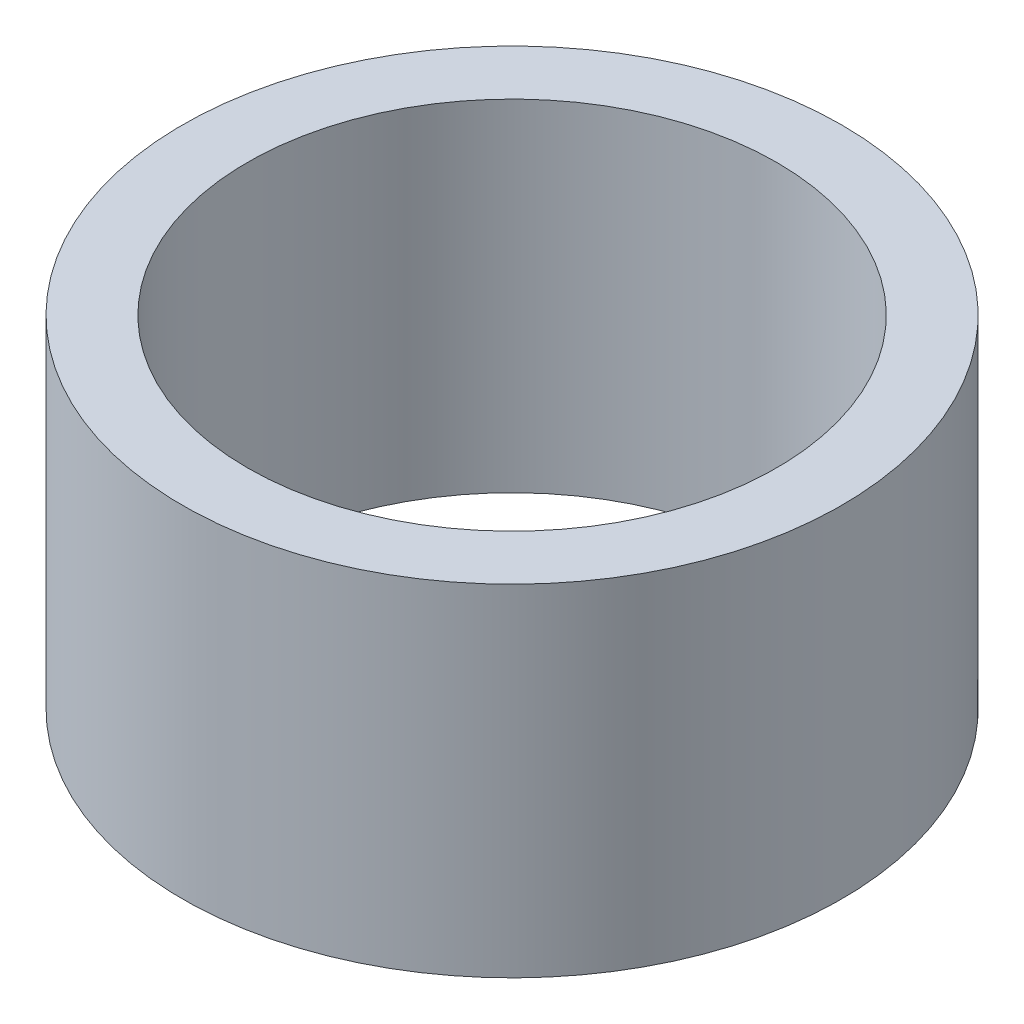
ISO-10303-21;
HEADER;
FILE_DESCRIPTION(('STEP AP214'),'2;1');
FILE_NAME('part.step','',(''),(''),'','','');
FILE_SCHEMA(('AUTOMOTIVE_DESIGN { 1 0 10303 214 1 1 1 1 }'));
ENDSEC;
DATA;
#1=APPLICATION_CONTEXT('core data for automotive mechanical design processes');
#2=APPLICATION_PROTOCOL_DEFINITION('international standard','automotive_design',2000,#1);
#3=PRODUCT_CONTEXT('',#1,'mechanical');
#4=PRODUCT('Part','Part','',(#3));
#5=PRODUCT_RELATED_PRODUCT_CATEGORY('part','',(#4));
#6=PRODUCT_DEFINITION_FORMATION('','',#4);
#7=PRODUCT_DEFINITION_CONTEXT('part definition',#1,'design');
#8=PRODUCT_DEFINITION('design','',#6,#7);
#9=PRODUCT_DEFINITION_SHAPE('','',#8);
#10=(LENGTH_UNIT() NAMED_UNIT(*) SI_UNIT(.MILLI.,.METRE.));
#11=(NAMED_UNIT(*) PLANE_ANGLE_UNIT() SI_UNIT($,.RADIAN.));
#12=(NAMED_UNIT(*) SI_UNIT($,.STERADIAN.) SOLID_ANGLE_UNIT());
#13=UNCERTAINTY_MEASURE_WITH_UNIT(LENGTH_MEASURE(1.E-05),#10,'distance_accuracy_value','');
#14=(GEOMETRIC_REPRESENTATION_CONTEXT(3) GLOBAL_UNCERTAINTY_ASSIGNED_CONTEXT((#13)) GLOBAL_UNIT_ASSIGNED_CONTEXT((#10,
#11,#12)) REPRESENTATION_CONTEXT('',''));
#15=CARTESIAN_POINT('',(0.,0.,0.));
#16=DIRECTION('',(0.,0.,1.));
#17=DIRECTION('',(1.,0.,0.));
#18=AXIS2_PLACEMENT_3D('',#15,#16,#17);
#19=CARTESIAN_POINT('',(0.,10.5,0.));
#20=DIRECTION('',(0.,1.,0.));
#21=DIRECTION('',(0.,0.,1.));
#22=AXIS2_PLACEMENT_3D('',#19,#20,#21);
#23=PLANE('',#22);
#24=CARTESIAN_POINT('',(0.,10.5,0.));
#25=DIRECTION('',(0.,1.,0.));
#26=DIRECTION('',(0.,0.,1.));
#27=AXIS2_PLACEMENT_3D('',#24,#25,#26);
#28=CIRCLE('',#27,10.15);
#29=CARTESIAN_POINT('',(0.,10.5,-10.15));
#30=VERTEX_POINT('',#29);
#31=EDGE_CURVE('E10',#30,#30,#28,.T.);
#32=ORIENTED_EDGE('',*,*,#31,.T.);
#33=EDGE_LOOP('',(#32));
#34=FACE_BOUND('',#33,.T.);
#35=CARTESIAN_POINT('',(0.,10.5,0.));
#36=DIRECTION('',(0.,1.,0.));
#37=DIRECTION('',(0.,0.,1.));
#38=AXIS2_PLACEMENT_3D('',#35,#36,#37);
#39=CIRCLE('',#38,8.15);
#40=CARTESIAN_POINT('',(0.,10.5,-8.15));
#41=VERTEX_POINT('',#40);
#42=EDGE_CURVE('E44',#41,#41,#39,.T.);
#43=ORIENTED_EDGE('',*,*,#42,.F.);
#44=EDGE_LOOP('',(#43));
#45=FACE_BOUND('',#44,.T.);
#46=ADVANCED_FACE('F33',(#34,#45),#23,.T.);
#47=CARTESIAN_POINT('',(0.,0.,0.));
#48=DIRECTION('',(0.,1.,0.));
#49=DIRECTION('',(0.,0.,1.));
#50=AXIS2_PLACEMENT_3D('',#47,#48,#49);
#51=PLANE('',#50);
#52=CARTESIAN_POINT('',(0.,0.,0.));
#53=DIRECTION('',(0.,1.,0.));
#54=DIRECTION('',(0.,0.,1.));
#55=AXIS2_PLACEMENT_3D('',#52,#53,#54);
#56=CIRCLE('',#55,10.15);
#57=CARTESIAN_POINT('',(0.,0.,-10.15));
#58=VERTEX_POINT('',#57);
#59=EDGE_CURVE('E37',#58,#58,#56,.T.);
#60=ORIENTED_EDGE('',*,*,#59,.F.);
#61=EDGE_LOOP('',(#60));
#62=FACE_BOUND('',#61,.T.);
#63=CARTESIAN_POINT('',(0.,0.,0.));
#64=DIRECTION('',(0.,1.,0.));
#65=DIRECTION('',(0.,0.,1.));
#66=AXIS2_PLACEMENT_3D('',#63,#64,#65);
#67=CIRCLE('',#66,8.15);
#68=CARTESIAN_POINT('',(0.,0.,-8.15));
#69=VERTEX_POINT('',#68);
#70=EDGE_CURVE('E46',#69,#69,#67,.T.);
#71=ORIENTED_EDGE('',*,*,#70,.T.);
#72=EDGE_LOOP('',(#71));
#73=FACE_BOUND('',#72,.T.);
#74=ADVANCED_FACE('F56',(#62,#73),#51,.F.);
#75=CARTESIAN_POINT('',(0.,10.5,0.));
#76=DIRECTION('',(0.,-1.,0.));
#77=DIRECTION('',(0.,0.,-1.));
#78=AXIS2_PLACEMENT_3D('',#75,#76,#77);
#79=CYLINDRICAL_SURFACE('',#78,10.15);
#80=CARTESIAN_POINT('',(0.,10.5,-10.15));
#81=CARTESIAN_POINT('',(0.,10.390625,-10.15));
#82=CARTESIAN_POINT('',(0.,10.28125,-10.15));
#83=CARTESIAN_POINT('',(0.,10.0625,-10.15));
#84=CARTESIAN_POINT('',(0.,9.953125,-10.15));
#85=CARTESIAN_POINT('',(0.,9.734375,-10.15));
#86=CARTESIAN_POINT('',(0.,9.625,-10.15));
#87=CARTESIAN_POINT('',(0.,9.40625,-10.15));
#88=CARTESIAN_POINT('',(0.,9.296875,-10.15));
#89=CARTESIAN_POINT('',(0.,9.078125,-10.15));
#90=CARTESIAN_POINT('',(0.,8.96875,-10.15));
#91=CARTESIAN_POINT('',(0.,8.75,-10.15));
#92=CARTESIAN_POINT('',(0.,8.640625,-10.15));
#93=CARTESIAN_POINT('',(0.,8.421875,-10.15));
#94=CARTESIAN_POINT('',(0.,8.3125,-10.15));
#95=CARTESIAN_POINT('',(0.,8.09375,-10.15));
#96=CARTESIAN_POINT('',(0.,7.984375,-10.15));
#97=CARTESIAN_POINT('',(0.,7.765625,-10.15));
#98=CARTESIAN_POINT('',(0.,7.65625,-10.15));
#99=CARTESIAN_POINT('',(0.,7.4375,-10.15));
#100=CARTESIAN_POINT('',(0.,7.328125,-10.15));
#101=CARTESIAN_POINT('',(0.,7.109375,-10.15));
#102=CARTESIAN_POINT('',(0.,7.,-10.15));
#103=CARTESIAN_POINT('',(0.,6.78125,-10.15));
#104=CARTESIAN_POINT('',(0.,6.671875,-10.15));
#105=CARTESIAN_POINT('',(0.,6.453125,-10.15));
#106=CARTESIAN_POINT('',(0.,6.34375,-10.15));
#107=CARTESIAN_POINT('',(0.,6.125,-10.15));
#108=CARTESIAN_POINT('',(0.,6.015625,-10.15));
#109=CARTESIAN_POINT('',(0.,5.796875,-10.15));
#110=CARTESIAN_POINT('',(0.,5.6875,-10.15));
#111=CARTESIAN_POINT('',(0.,5.46875,-10.15));
#112=CARTESIAN_POINT('',(0.,5.359375,-10.15));
#113=CARTESIAN_POINT('',(0.,5.140625,-10.15));
#114=CARTESIAN_POINT('',(0.,5.03125,-10.15));
#115=CARTESIAN_POINT('',(0.,4.8125,-10.15));
#116=CARTESIAN_POINT('',(0.,4.703125,-10.15));
#117=CARTESIAN_POINT('',(0.,4.484375,-10.15));
#118=CARTESIAN_POINT('',(0.,4.375,-10.15));
#119=CARTESIAN_POINT('',(0.,4.15625,-10.15));
#120=CARTESIAN_POINT('',(0.,4.046875,-10.15));
#121=CARTESIAN_POINT('',(0.,3.828125,-10.15));
#122=CARTESIAN_POINT('',(0.,3.71875,-10.15));
#123=CARTESIAN_POINT('',(0.,3.5,-10.15));
#124=CARTESIAN_POINT('',(0.,3.390625,-10.15));
#125=CARTESIAN_POINT('',(0.,3.171875,-10.15));
#126=CARTESIAN_POINT('',(0.,3.0625,-10.15));
#127=CARTESIAN_POINT('',(0.,2.84375,-10.15));
#128=CARTESIAN_POINT('',(0.,2.734375,-10.15));
#129=CARTESIAN_POINT('',(0.,2.515625,-10.15));
#130=CARTESIAN_POINT('',(0.,2.40625,-10.15));
#131=CARTESIAN_POINT('',(0.,2.1875,-10.15));
#132=CARTESIAN_POINT('',(0.,2.078125,-10.15));
#133=CARTESIAN_POINT('',(0.,1.859375,-10.15));
#134=CARTESIAN_POINT('',(0.,1.75,-10.15));
#135=CARTESIAN_POINT('',(0.,1.53125,-10.15));
#136=CARTESIAN_POINT('',(0.,1.421875,-10.15));
#137=CARTESIAN_POINT('',(0.,1.203125,-10.15));
#138=CARTESIAN_POINT('',(0.,1.09375,-10.15));
#139=CARTESIAN_POINT('',(0.,0.875000000000001,-10.15));
#140=CARTESIAN_POINT('',(0.,0.765625000000001,-10.15));
#141=CARTESIAN_POINT('',(0.,0.546875,-10.15));
#142=CARTESIAN_POINT('',(0.,0.4375,-10.15));
#143=CARTESIAN_POINT('',(0.,0.21875,-10.15));
#144=CARTESIAN_POINT('',(0.,0.109375,-10.15));
#145=CARTESIAN_POINT('',(0.,0.,-10.15));
#146=B_SPLINE_CURVE_WITH_KNOTS('',3,(#80,#81,#82,#83,#84,#85,#86,#87,#88,#89,#90,#91,#92,#93,
#94,#95,#96,#97,#98,#99,#100,#101,#102,#103,#104,#105,#106,#107,#108,#109,#110,#111,#112,#113,
#114,#115,#116,#117,#118,#119,#120,#121,#122,#123,#124,#125,#126,#127,#128,#129,#130,#131,#132,
#133,#134,#135,#136,#137,#138,#139,#140,#141,#142,#143,#144,#145),.UNSPECIFIED.,.F.,.F.,(4,2,2,
2,2,2,2,2,2,2,2,2,2,2,2,2,2,2,2,2,2,2,2,2,2,2,2,2,2,2,2,2,4),(0.,0.328124999999999,
0.656249999999999,0.984374999999999,1.3125,1.640625,1.96875,2.296875,2.625,2.953125,3.28125,
3.609375,3.9375,4.265625,4.59375,4.921875,5.25,5.578125,5.90625,6.234375,6.5625,6.890625,
7.21875,7.546875,7.875,8.203125,8.53125,8.859375,9.1875,9.515625,9.84375,10.171875,10.5),.UNSPECIFIED.);
#147=EDGE_CURVE('BSEAM35',#30,#58,#146,.T.);
#148=ORIENTED_EDGE('',*,*,#31,.F.);
#149=ORIENTED_EDGE('',*,*,#59,.T.);
#150=ORIENTED_EDGE('',*,*,#147,.T.);
#151=ORIENTED_EDGE('',*,*,#147,.F.);
#152=EDGE_LOOP('',(#148,#150,#149,#151));
#153=FACE_BOUND('',#152,.T.);
#154=ADVANCED_FACE('F35',(#153),#79,.T.);
#155=CARTESIAN_POINT('',(0.,10.5,0.));
#156=DIRECTION('',(0.,-1.,0.));
#157=DIRECTION('',(0.,0.,-1.));
#158=AXIS2_PLACEMENT_3D('',#155,#156,#157);
#159=CYLINDRICAL_SURFACE('',#158,8.15);
#160=CARTESIAN_POINT('',(0.,10.5,-8.15));
#161=CARTESIAN_POINT('',(0.,10.390625,-8.15));
#162=CARTESIAN_POINT('',(0.,10.28125,-8.15));
#163=CARTESIAN_POINT('',(0.,10.0625,-8.15));
#164=CARTESIAN_POINT('',(0.,9.953125,-8.15));
#165=CARTESIAN_POINT('',(0.,9.734375,-8.15));
#166=CARTESIAN_POINT('',(0.,9.625,-8.15));
#167=CARTESIAN_POINT('',(0.,9.40625,-8.15));
#168=CARTESIAN_POINT('',(0.,9.296875,-8.15));
#169=CARTESIAN_POINT('',(0.,9.078125,-8.15));
#170=CARTESIAN_POINT('',(0.,8.96875,-8.15));
#171=CARTESIAN_POINT('',(0.,8.75,-8.15));
#172=CARTESIAN_POINT('',(0.,8.640625,-8.15));
#173=CARTESIAN_POINT('',(0.,8.421875,-8.15));
#174=CARTESIAN_POINT('',(0.,8.3125,-8.15));
#175=CARTESIAN_POINT('',(0.,8.09375,-8.15));
#176=CARTESIAN_POINT('',(0.,7.984375,-8.15));
#177=CARTESIAN_POINT('',(0.,7.765625,-8.15));
#178=CARTESIAN_POINT('',(0.,7.65625,-8.15));
#179=CARTESIAN_POINT('',(0.,7.4375,-8.15));
#180=CARTESIAN_POINT('',(0.,7.328125,-8.15));
#181=CARTESIAN_POINT('',(0.,7.109375,-8.15));
#182=CARTESIAN_POINT('',(0.,7.,-8.15));
#183=CARTESIAN_POINT('',(0.,6.78125,-8.15));
#184=CARTESIAN_POINT('',(0.,6.671875,-8.15));
#185=CARTESIAN_POINT('',(0.,6.453125,-8.15));
#186=CARTESIAN_POINT('',(0.,6.34375,-8.15));
#187=CARTESIAN_POINT('',(0.,6.125,-8.15));
#188=CARTESIAN_POINT('',(0.,6.015625,-8.15));
#189=CARTESIAN_POINT('',(0.,5.796875,-8.15));
#190=CARTESIAN_POINT('',(0.,5.6875,-8.15));
#191=CARTESIAN_POINT('',(0.,5.46875,-8.15));
#192=CARTESIAN_POINT('',(0.,5.359375,-8.15));
#193=CARTESIAN_POINT('',(0.,5.140625,-8.15));
#194=CARTESIAN_POINT('',(0.,5.03125,-8.15));
#195=CARTESIAN_POINT('',(0.,4.8125,-8.15));
#196=CARTESIAN_POINT('',(0.,4.703125,-8.15));
#197=CARTESIAN_POINT('',(0.,4.484375,-8.15));
#198=CARTESIAN_POINT('',(0.,4.375,-8.15));
#199=CARTESIAN_POINT('',(0.,4.15625,-8.15));
#200=CARTESIAN_POINT('',(0.,4.046875,-8.15));
#201=CARTESIAN_POINT('',(0.,3.828125,-8.15));
#202=CARTESIAN_POINT('',(0.,3.71875,-8.15));
#203=CARTESIAN_POINT('',(0.,3.5,-8.15));
#204=CARTESIAN_POINT('',(0.,3.390625,-8.15));
#205=CARTESIAN_POINT('',(0.,3.171875,-8.15));
#206=CARTESIAN_POINT('',(0.,3.0625,-8.15));
#207=CARTESIAN_POINT('',(0.,2.84375,-8.15));
#208=CARTESIAN_POINT('',(0.,2.734375,-8.15));
#209=CARTESIAN_POINT('',(0.,2.515625,-8.15));
#210=CARTESIAN_POINT('',(0.,2.40625,-8.15));
#211=CARTESIAN_POINT('',(0.,2.1875,-8.15));
#212=CARTESIAN_POINT('',(0.,2.078125,-8.15));
#213=CARTESIAN_POINT('',(0.,1.859375,-8.15));
#214=CARTESIAN_POINT('',(0.,1.75,-8.15));
#215=CARTESIAN_POINT('',(0.,1.53125,-8.15));
#216=CARTESIAN_POINT('',(0.,1.421875,-8.15));
#217=CARTESIAN_POINT('',(0.,1.203125,-8.15));
#218=CARTESIAN_POINT('',(0.,1.09375,-8.15));
#219=CARTESIAN_POINT('',(0.,0.875000000000001,-8.15));
#220=CARTESIAN_POINT('',(0.,0.765625000000001,-8.15));
#221=CARTESIAN_POINT('',(0.,0.546875,-8.15));
#222=CARTESIAN_POINT('',(0.,0.4375,-8.15));
#223=CARTESIAN_POINT('',(0.,0.21875,-8.15));
#224=CARTESIAN_POINT('',(0.,0.109375,-8.15));
#225=CARTESIAN_POINT('',(0.,0.,-8.15));
#226=B_SPLINE_CURVE_WITH_KNOTS('',3,(#160,#161,#162,#163,#164,#165,#166,#167,#168,#169,#170,
#171,#172,#173,#174,#175,#176,#177,#178,#179,#180,#181,#182,#183,#184,#185,#186,#187,#188,#189,
#190,#191,#192,#193,#194,#195,#196,#197,#198,#199,#200,#201,#202,#203,#204,#205,#206,#207,#208,
#209,#210,#211,#212,#213,#214,#215,#216,#217,#218,#219,#220,#221,#222,#223,#224,#225),
.UNSPECIFIED.,.F.,.F.,(4,2,2,2,2,2,2,2,2,2,2,2,2,2,2,2,2,2,2,2,2,2,2,2,2,2,2,2,2,2,2,2,4),(0.,
0.328124999999999,0.656249999999999,0.984374999999999,1.3125,1.640625,1.96875,2.296875,2.625,
2.953125,3.28125,3.609375,3.9375,4.265625,4.59375,4.921875,5.25,5.578125,5.90625,6.234375,
6.5625,6.890625,7.21875,7.546875,7.875,8.203125,8.53125,8.859375,9.1875,9.515625,9.84375,
10.171875,10.5),.UNSPECIFIED.);
#227=EDGE_CURVE('BSEAM52',#41,#69,#226,.T.);
#228=ORIENTED_EDGE('',*,*,#42,.T.);
#229=ORIENTED_EDGE('',*,*,#70,.F.);
#230=ORIENTED_EDGE('',*,*,#227,.T.);
#231=ORIENTED_EDGE('',*,*,#227,.F.);
#232=EDGE_LOOP('',(#228,#230,#229,#231));
#233=FACE_BOUND('',#232,.T.);
#234=ADVANCED_FACE('F52',(#233),#159,.F.);
#235=CLOSED_SHELL('',(#46,#74,#154,#234));
#236=MANIFOLD_SOLID_BREP('B2',#235);
#237=ADVANCED_BREP_SHAPE_REPRESENTATION('',(#18,#236),#14);
#238=SHAPE_DEFINITION_REPRESENTATION(#9,#237);
ENDSEC;
END-ISO-10303-21;
